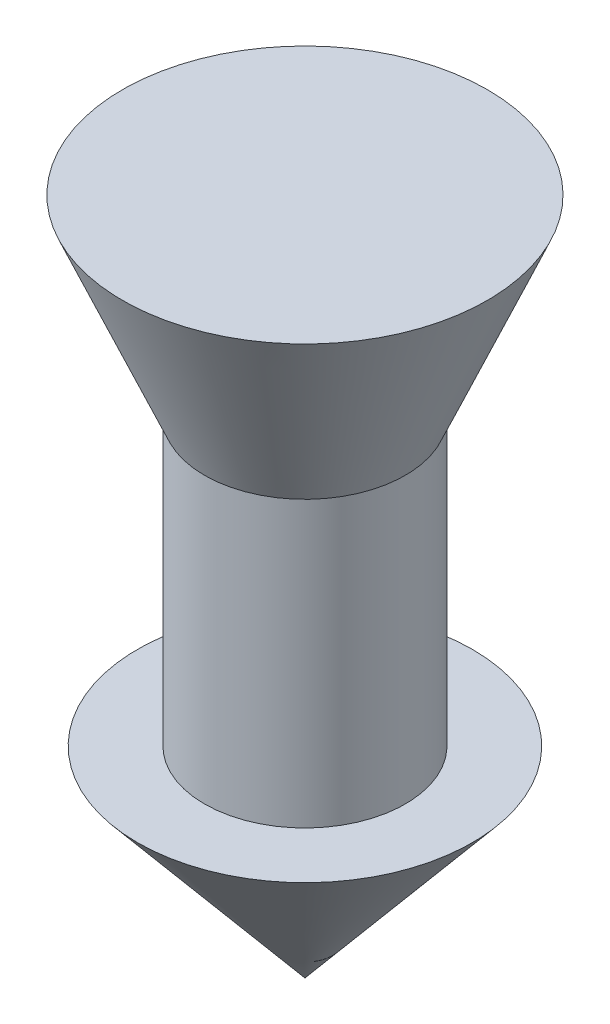
ISO-10303-21;
HEADER;
FILE_DESCRIPTION(('STEP AP214'),'2;1');
FILE_NAME('part.step','',(''),(''),'','','');
FILE_SCHEMA(('AUTOMOTIVE_DESIGN { 1 0 10303 214 1 1 1 1 }'));
ENDSEC;
DATA;
#1=APPLICATION_CONTEXT('core data for automotive mechanical design processes');
#2=APPLICATION_PROTOCOL_DEFINITION('international standard','automotive_design',2000,#1);
#3=PRODUCT_CONTEXT('',#1,'mechanical');
#4=PRODUCT('Part','Part','',(#3));
#5=PRODUCT_RELATED_PRODUCT_CATEGORY('part','',(#4));
#6=PRODUCT_DEFINITION_FORMATION('','',#4);
#7=PRODUCT_DEFINITION_CONTEXT('part definition',#1,'design');
#8=PRODUCT_DEFINITION('design','',#6,#7);
#9=PRODUCT_DEFINITION_SHAPE('','',#8);
#10=(LENGTH_UNIT() NAMED_UNIT(*) SI_UNIT(.MILLI.,.METRE.));
#11=(NAMED_UNIT(*) PLANE_ANGLE_UNIT() SI_UNIT($,.RADIAN.));
#12=(NAMED_UNIT(*) SI_UNIT($,.STERADIAN.) SOLID_ANGLE_UNIT());
#13=UNCERTAINTY_MEASURE_WITH_UNIT(LENGTH_MEASURE(1.E-05),#10,'distance_accuracy_value','');
#14=(GEOMETRIC_REPRESENTATION_CONTEXT(3) GLOBAL_UNCERTAINTY_ASSIGNED_CONTEXT((#13)) GLOBAL_UNIT_ASSIGNED_CONTEXT((#10,
#11,#12)) REPRESENTATION_CONTEXT('',''));
#15=CARTESIAN_POINT('',(0.,0.,0.));
#16=DIRECTION('',(0.,0.,1.));
#17=DIRECTION('',(1.,0.,0.));
#18=AXIS2_PLACEMENT_3D('',#15,#16,#17);
#19=CARTESIAN_POINT('',(0.,40.5,0.));
#20=DIRECTION('',(0.,-1.,0.));
#21=DIRECTION('',(0.,0.,-1.));
#22=AXIS2_PLACEMENT_3D('',#19,#20,#21);
#23=PLANE('',#22);
#24=CARTESIAN_POINT('',(0.,40.5,0.));
#25=DIRECTION('',(0.,-1.,0.));
#26=DIRECTION('',(0.,0.,-1.));
#27=AXIS2_PLACEMENT_3D('',#24,#25,#26);
#28=CIRCLE('',#27,10.9);
#29=CARTESIAN_POINT('',(0.,40.5,-10.9));
#30=VERTEX_POINT('',#29);
#31=EDGE_CURVE('E11',#30,#30,#28,.T.);
#32=ORIENTED_EDGE('',*,*,#31,.F.);
#33=EDGE_LOOP('',(#32));
#34=FACE_BOUND('',#33,.T.);
#35=ADVANCED_FACE('F41',(#34),#23,.F.);
#36=CARTESIAN_POINT('',(0.,40.5,0.));
#37=DIRECTION('',(0.,1.,0.));
#38=DIRECTION('',(0.,0.,1.));
#39=AXIS2_PLACEMENT_3D('',#36,#37,#38);
#40=CONICAL_SURFACE('',#39,10.9,0.402790949039648);
#41=CARTESIAN_POINT('',(0.,29.,0.));
#42=DIRECTION('',(0.,-1.,0.));
#43=DIRECTION('',(0.,0.,-1.));
#44=AXIS2_PLACEMENT_3D('',#41,#42,#43);
#45=CIRCLE('',#44,6.);
#46=CARTESIAN_POINT('',(0.,29.,-6.));
#47=VERTEX_POINT('',#46);
#48=EDGE_CURVE('E47',#47,#47,#45,.T.);
#49=ORIENTED_EDGE('',*,*,#48,.F.);
#50=EDGE_LOOP('',(#49));
#51=FACE_BOUND('',#50,.T.);
#52=ORIENTED_EDGE('',*,*,#31,.T.);
#53=EDGE_LOOP('',(#52));
#54=FACE_BOUND('',#53,.T.);
#55=ADVANCED_FACE('F63',(#51,#54),#40,.T.);
#56=CARTESIAN_POINT('',(0.,0.,0.));
#57=DIRECTION('',(0.,-1.,0.));
#58=DIRECTION('',(0.,0.,-1.));
#59=AXIS2_PLACEMENT_3D('',#56,#57,#58);
#60=CYLINDRICAL_SURFACE('',#59,6.);
#61=ORIENTED_EDGE('',*,*,#48,.T.);
#62=EDGE_LOOP('',(#61));
#63=FACE_BOUND('',#62,.T.);
#64=CARTESIAN_POINT('',(0.,12.,0.));
#65=DIRECTION('',(0.,-1.,0.));
#66=DIRECTION('',(0.,0.,-1.));
#67=AXIS2_PLACEMENT_3D('',#64,#65,#66);
#68=CIRCLE('',#67,6.);
#69=CARTESIAN_POINT('',(0.,12.,-6.));
#70=VERTEX_POINT('',#69);
#71=EDGE_CURVE('E78',#70,#70,#68,.T.);
#72=ORIENTED_EDGE('',*,*,#71,.F.);
#73=EDGE_LOOP('',(#72));
#74=FACE_BOUND('',#73,.T.);
#75=ADVANCED_FACE('F58',(#63,#74),#60,.T.);
#76=CARTESIAN_POINT('',(0.,12.,-10.));
#77=DIRECTION('',(0.,1.,0.));
#78=DIRECTION('',(0.,0.,1.));
#79=AXIS2_PLACEMENT_3D('',#76,#77,#78);
#80=PLANE('',#79);
#81=ORIENTED_EDGE('',*,*,#71,.T.);
#82=EDGE_LOOP('',(#81));
#83=FACE_BOUND('',#82,.T.);
#84=CARTESIAN_POINT('',(0.,12.,0.));
#85=DIRECTION('',(0.,-1.,0.));
#86=DIRECTION('',(0.,0.,-1.));
#87=AXIS2_PLACEMENT_3D('',#84,#85,#86);
#88=CIRCLE('',#87,10.);
#89=CARTESIAN_POINT('',(0.,12.,-10.));
#90=VERTEX_POINT('',#89);
#91=EDGE_CURVE('E80',#90,#90,#88,.T.);
#92=ORIENTED_EDGE('',*,*,#91,.F.);
#93=EDGE_LOOP('',(#92));
#94=FACE_BOUND('',#93,.T.);
#95=ADVANCED_FACE('F52',(#83,#94),#80,.T.);
#96=CARTESIAN_POINT('',(0.,0.,0.));
#97=DIRECTION('',(0.,1.,0.));
#98=DIRECTION('',(0.,0.,1.));
#99=AXIS2_PLACEMENT_3D('',#96,#97,#98);
#100=CONICAL_SURFACE('',#99,0.,0.694738276196703);
#101=ORIENTED_EDGE('',*,*,#91,.T.);
#102=EDGE_LOOP('',(#101));
#103=FACE_BOUND('',#102,.T.);
#104=CARTESIAN_POINT('',(0.,0.,0.));
#105=VERTEX_POINT('',#104);
#106=VERTEX_LOOP('',#105);
#107=FACE_BOUND('',#106,.T.);
#108=ADVANCED_FACE('F50',(#103,#107),#100,.T.);
#109=CLOSED_SHELL('',(#35,#55,#75,#95,#108));
#110=MANIFOLD_SOLID_BREP('B2',#109);
#111=ADVANCED_BREP_SHAPE_REPRESENTATION('',(#18,#110),#14);
#112=SHAPE_DEFINITION_REPRESENTATION(#9,#111);
ENDSEC;
END-ISO-10303-21;
